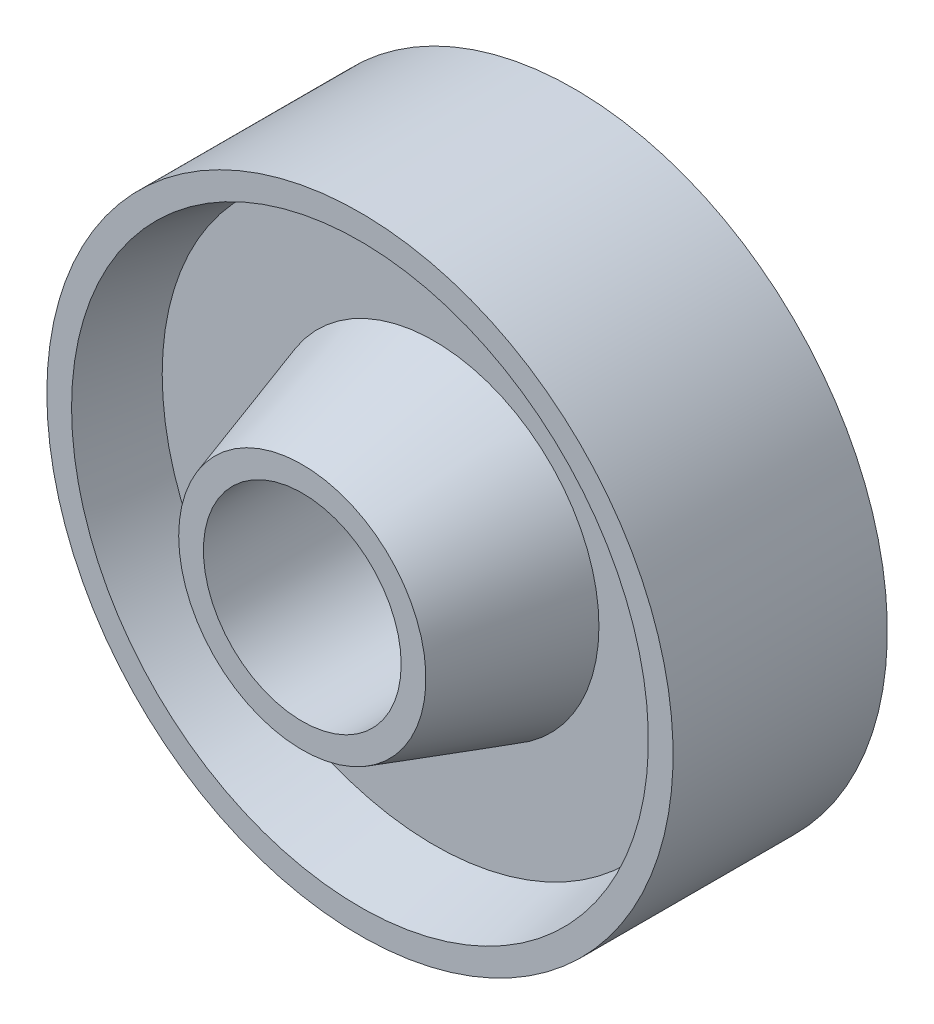
ISO-10303-21;
HEADER;
FILE_DESCRIPTION(('STEP AP214'),'2;1');
FILE_NAME('part.step','',(''),(''),'','','');
FILE_SCHEMA(('AUTOMOTIVE_DESIGN { 1 0 10303 214 1 1 1 1 }'));
ENDSEC;
DATA;
#1=APPLICATION_CONTEXT('core data for automotive mechanical design processes');
#2=APPLICATION_PROTOCOL_DEFINITION('international standard','automotive_design',2000,#1);
#3=PRODUCT_CONTEXT('',#1,'mechanical');
#4=PRODUCT('Part','Part','',(#3));
#5=PRODUCT_RELATED_PRODUCT_CATEGORY('part','',(#4));
#6=PRODUCT_DEFINITION_FORMATION('','',#4);
#7=PRODUCT_DEFINITION_CONTEXT('part definition',#1,'design');
#8=PRODUCT_DEFINITION('design','',#6,#7);
#9=PRODUCT_DEFINITION_SHAPE('','',#8);
#10=(LENGTH_UNIT() NAMED_UNIT(*) SI_UNIT(.MILLI.,.METRE.));
#11=(NAMED_UNIT(*) PLANE_ANGLE_UNIT() SI_UNIT($,.RADIAN.));
#12=(NAMED_UNIT(*) SI_UNIT($,.STERADIAN.) SOLID_ANGLE_UNIT());
#13=UNCERTAINTY_MEASURE_WITH_UNIT(LENGTH_MEASURE(1.E-05),#10,'distance_accuracy_value','');
#14=(GEOMETRIC_REPRESENTATION_CONTEXT(3) GLOBAL_UNCERTAINTY_ASSIGNED_CONTEXT((#13)) GLOBAL_UNIT_ASSIGNED_CONTEXT((#10,
#11,#12)) REPRESENTATION_CONTEXT('',''));
#15=CARTESIAN_POINT('',(0.,0.,0.));
#16=DIRECTION('',(0.,0.,1.));
#17=DIRECTION('',(1.,0.,0.));
#18=AXIS2_PLACEMENT_3D('',#15,#16,#17);
#19=CARTESIAN_POINT('',(15.,0.,-20.));
#20=DIRECTION('',(0.,0.,1.));
#21=DIRECTION('',(1.,0.,0.));
#22=AXIS2_PLACEMENT_3D('',#19,#20,#21);
#23=PLANE('',#22);
#24=CARTESIAN_POINT('',(0.,0.,-20.));
#25=DIRECTION('',(0.,0.,1.));
#26=DIRECTION('',(1.,0.,0.));
#27=AXIS2_PLACEMENT_3D('',#24,#25,#26);
#28=CIRCLE('',#27,12.);
#29=CARTESIAN_POINT('',(12.,0.,-20.));
#30=VERTEX_POINT('',#29);
#31=EDGE_CURVE('E68',#30,#30,#28,.F.);
#32=ORIENTED_EDGE('',*,*,#31,.F.);
#33=EDGE_LOOP('',(#32));
#34=FACE_BOUND('',#33,.T.);
#35=CARTESIAN_POINT('',(0.,0.,-20.));
#36=DIRECTION('',(0.,0.,-1.));
#37=DIRECTION('',(-1.,0.,0.));
#38=AXIS2_PLACEMENT_3D('',#35,#36,#37);
#39=CIRCLE('',#38,15.);
#40=CARTESIAN_POINT('',(-15.,0.,-20.));
#41=VERTEX_POINT('',#40);
#42=EDGE_CURVE('E65',#41,#41,#39,.T.);
#43=ORIENTED_EDGE('',*,*,#42,.T.);
#44=EDGE_LOOP('',(#43));
#45=FACE_BOUND('',#44,.T.);
#46=ADVANCED_FACE('F31',(#34,#45),#23,.F.);
#47=CARTESIAN_POINT('',(0.,0.,20.));
#48=DIRECTION('',(0.,0.,-1.));
#49=DIRECTION('',(-1.,0.,0.));
#50=AXIS2_PLACEMENT_3D('',#47,#48,#49);
#51=PLANE('',#50);
#52=CARTESIAN_POINT('',(0.,0.,20.));
#53=DIRECTION('',(0.,0.,1.));
#54=DIRECTION('',(1.,0.,0.));
#55=AXIS2_PLACEMENT_3D('',#52,#53,#54);
#56=CIRCLE('',#55,12.);
#57=CARTESIAN_POINT('',(12.,0.,20.));
#58=VERTEX_POINT('',#57);
#59=EDGE_CURVE('E71',#58,#58,#56,.T.);
#60=ORIENTED_EDGE('',*,*,#59,.F.);
#61=EDGE_LOOP('',(#60));
#62=FACE_BOUND('',#61,.T.);
#63=CARTESIAN_POINT('',(0.,0.,20.));
#64=DIRECTION('',(0.,0.,-1.));
#65=DIRECTION('',(-1.,0.,0.));
#66=AXIS2_PLACEMENT_3D('',#63,#64,#65);
#67=CIRCLE('',#66,15.);
#68=CARTESIAN_POINT('',(-15.,0.,20.));
#69=VERTEX_POINT('',#68);
#70=EDGE_CURVE('E10',#69,#69,#67,.T.);
#71=ORIENTED_EDGE('',*,*,#70,.F.);
#72=EDGE_LOOP('',(#71));
#73=FACE_BOUND('',#72,.T.);
#74=ADVANCED_FACE('F77',(#62,#73),#51,.F.);
#75=CARTESIAN_POINT('',(0.,0.,20.));
#76=DIRECTION('',(0.,0.,-1.));
#77=DIRECTION('',(-1.,0.,0.));
#78=AXIS2_PLACEMENT_3D('',#75,#76,#77);
#79=CONICAL_SURFACE('',#78,15.,0.302884868374971);
#80=CARTESIAN_POINT('',(0.,0.,4.));
#81=DIRECTION('',(0.,0.,-1.));
#82=DIRECTION('',(-1.,0.,0.));
#83=AXIS2_PLACEMENT_3D('',#80,#81,#82);
#84=CIRCLE('',#83,20.);
#85=CARTESIAN_POINT('',(-20.,0.,4.));
#86=VERTEX_POINT('',#85);
#87=EDGE_CURVE('E37',#86,#86,#84,.T.);
#88=ORIENTED_EDGE('',*,*,#87,.F.);
#89=EDGE_LOOP('',(#88));
#90=FACE_BOUND('',#89,.T.);
#91=ORIENTED_EDGE('',*,*,#70,.T.);
#92=EDGE_LOOP('',(#91));
#93=FACE_BOUND('',#92,.T.);
#94=ADVANCED_FACE('F80',(#90,#93),#79,.T.);
#95=CARTESIAN_POINT('',(20.,0.,4.));
#96=DIRECTION('',(0.,0.,-1.));
#97=DIRECTION('',(-1.,0.,0.));
#98=AXIS2_PLACEMENT_3D('',#95,#96,#97);
#99=PLANE('',#98);
#100=CARTESIAN_POINT('',(0.,0.,4.));
#101=DIRECTION('',(0.,0.,-1.));
#102=DIRECTION('',(-1.,0.,0.));
#103=AXIS2_PLACEMENT_3D('',#100,#101,#102);
#104=CIRCLE('',#103,33.);
#105=CARTESIAN_POINT('',(-33.,0.,4.));
#106=VERTEX_POINT('',#105);
#107=EDGE_CURVE('E41',#106,#106,#104,.T.);
#108=ORIENTED_EDGE('',*,*,#107,.F.);
#109=EDGE_LOOP('',(#108));
#110=FACE_BOUND('',#109,.T.);
#111=ORIENTED_EDGE('',*,*,#87,.T.);
#112=EDGE_LOOP('',(#111));
#113=FACE_BOUND('',#112,.T.);
#114=ADVANCED_FACE('F85',(#110,#113),#99,.F.);
#115=CARTESIAN_POINT('',(0.,0.,4.));
#116=DIRECTION('',(0.,0.,1.));
#117=DIRECTION('',(1.,0.,0.));
#118=AXIS2_PLACEMENT_3D('',#115,#116,#117);
#119=CONICAL_SURFACE('',#118,33.,0.218668945873941);
#120=CARTESIAN_POINT('',(0.,0.,13.));
#121=DIRECTION('',(0.,0.,-1.));
#122=DIRECTION('',(-1.,0.,0.));
#123=AXIS2_PLACEMENT_3D('',#120,#121,#122);
#124=CIRCLE('',#123,35.);
#125=CARTESIAN_POINT('',(-35.,0.,13.));
#126=VERTEX_POINT('',#125);
#127=EDGE_CURVE('E45',#126,#126,#124,.T.);
#128=ORIENTED_EDGE('',*,*,#127,.F.);
#129=EDGE_LOOP('',(#128));
#130=FACE_BOUND('',#129,.T.);
#131=ORIENTED_EDGE('',*,*,#107,.T.);
#132=EDGE_LOOP('',(#131));
#133=FACE_BOUND('',#132,.T.);
#134=ADVANCED_FACE('F92',(#130,#133),#119,.F.);
#135=CARTESIAN_POINT('',(35.,0.,13.));
#136=DIRECTION('',(0.,0.,-1.));
#137=DIRECTION('',(-1.,0.,0.));
#138=AXIS2_PLACEMENT_3D('',#135,#136,#137);
#139=PLANE('',#138);
#140=CARTESIAN_POINT('',(0.,0.,13.));
#141=DIRECTION('',(0.,0.,-1.));
#142=DIRECTION('',(-1.,0.,0.));
#143=AXIS2_PLACEMENT_3D('',#140,#141,#142);
#144=CIRCLE('',#143,38.);
#145=CARTESIAN_POINT('',(-38.,0.,13.));
#146=VERTEX_POINT('',#145);
#147=EDGE_CURVE('E50',#146,#146,#144,.T.);
#148=ORIENTED_EDGE('',*,*,#147,.F.);
#149=EDGE_LOOP('',(#148));
#150=FACE_BOUND('',#149,.T.);
#151=ORIENTED_EDGE('',*,*,#127,.T.);
#152=EDGE_LOOP('',(#151));
#153=FACE_BOUND('',#152,.T.);
#154=ADVANCED_FACE('F96',(#150,#153),#139,.F.);
#155=CARTESIAN_POINT('',(0.,0.,-47.3507462686568));
#156=DIRECTION('',(0.,0.,-1.));
#157=DIRECTION('',(-1.,0.,0.));
#158=AXIS2_PLACEMENT_3D('',#155,#156,#157);
#159=CYLINDRICAL_SURFACE('',#158,38.);
#160=CARTESIAN_POINT('',(0.,0.,-13.));
#161=DIRECTION('',(0.,0.,-1.));
#162=DIRECTION('',(-1.,0.,0.));
#163=AXIS2_PLACEMENT_3D('',#160,#161,#162);
#164=CIRCLE('',#163,38.);
#165=CARTESIAN_POINT('',(-38.,0.,-13.));
#166=VERTEX_POINT('',#165);
#167=EDGE_CURVE('E53',#166,#166,#164,.T.);
#168=ORIENTED_EDGE('',*,*,#167,.F.);
#169=EDGE_LOOP('',(#168));
#170=FACE_BOUND('',#169,.T.);
#171=ORIENTED_EDGE('',*,*,#147,.T.);
#172=EDGE_LOOP('',(#171));
#173=FACE_BOUND('',#172,.T.);
#174=ADVANCED_FACE('F100',(#170,#173),#159,.T.);
#175=CARTESIAN_POINT('',(38.,0.,-13.));
#176=DIRECTION('',(0.,0.,1.));
#177=DIRECTION('',(1.,0.,0.));
#178=AXIS2_PLACEMENT_3D('',#175,#176,#177);
#179=PLANE('',#178);
#180=CARTESIAN_POINT('',(0.,0.,-13.));
#181=DIRECTION('',(0.,0.,-1.));
#182=DIRECTION('',(-1.,0.,0.));
#183=AXIS2_PLACEMENT_3D('',#180,#181,#182);
#184=CIRCLE('',#183,35.);
#185=CARTESIAN_POINT('',(-35.,0.,-13.));
#186=VERTEX_POINT('',#185);
#187=EDGE_CURVE('E56',#186,#186,#184,.T.);
#188=ORIENTED_EDGE('',*,*,#187,.F.);
#189=EDGE_LOOP('',(#188));
#190=FACE_BOUND('',#189,.T.);
#191=ORIENTED_EDGE('',*,*,#167,.T.);
#192=EDGE_LOOP('',(#191));
#193=FACE_BOUND('',#192,.T.);
#194=ADVANCED_FACE('F104',(#190,#193),#179,.F.);
#195=CARTESIAN_POINT('',(0.,0.,-13.));
#196=DIRECTION('',(0.,0.,-1.));
#197=DIRECTION('',(-1.,0.,0.));
#198=AXIS2_PLACEMENT_3D('',#195,#196,#197);
#199=CONICAL_SURFACE('',#198,35.,0.218668945873941);
#200=CARTESIAN_POINT('',(0.,0.,-4.));
#201=DIRECTION('',(0.,0.,-1.));
#202=DIRECTION('',(-1.,0.,0.));
#203=AXIS2_PLACEMENT_3D('',#200,#201,#202);
#204=CIRCLE('',#203,33.);
#205=CARTESIAN_POINT('',(-33.,0.,-4.));
#206=VERTEX_POINT('',#205);
#207=EDGE_CURVE('E59',#206,#206,#204,.T.);
#208=ORIENTED_EDGE('',*,*,#207,.F.);
#209=EDGE_LOOP('',(#208));
#210=FACE_BOUND('',#209,.T.);
#211=ORIENTED_EDGE('',*,*,#187,.T.);
#212=EDGE_LOOP('',(#211));
#213=FACE_BOUND('',#212,.T.);
#214=ADVANCED_FACE('F108',(#210,#213),#199,.F.);
#215=CARTESIAN_POINT('',(33.,0.,-4.));
#216=DIRECTION('',(0.,0.,1.));
#217=DIRECTION('',(1.,0.,0.));
#218=AXIS2_PLACEMENT_3D('',#215,#216,#217);
#219=PLANE('',#218);
#220=CARTESIAN_POINT('',(0.,0.,-4.));
#221=DIRECTION('',(0.,0.,-1.));
#222=DIRECTION('',(-1.,0.,0.));
#223=AXIS2_PLACEMENT_3D('',#220,#221,#222);
#224=CIRCLE('',#223,20.);
#225=CARTESIAN_POINT('',(-20.,0.,-4.));
#226=VERTEX_POINT('',#225);
#227=EDGE_CURVE('E62',#226,#226,#224,.T.);
#228=ORIENTED_EDGE('',*,*,#227,.F.);
#229=EDGE_LOOP('',(#228));
#230=FACE_BOUND('',#229,.T.);
#231=ORIENTED_EDGE('',*,*,#207,.T.);
#232=EDGE_LOOP('',(#231));
#233=FACE_BOUND('',#232,.T.);
#234=ADVANCED_FACE('F112',(#230,#233),#219,.F.);
#235=CARTESIAN_POINT('',(0.,0.,-4.));
#236=DIRECTION('',(0.,0.,1.));
#237=DIRECTION('',(1.,0.,0.));
#238=AXIS2_PLACEMENT_3D('',#235,#236,#237);
#239=CONICAL_SURFACE('',#238,20.,0.302884868374971);
#240=ORIENTED_EDGE('',*,*,#42,.F.);
#241=EDGE_LOOP('',(#240));
#242=FACE_BOUND('',#241,.T.);
#243=ORIENTED_EDGE('',*,*,#227,.T.);
#244=EDGE_LOOP('',(#243));
#245=FACE_BOUND('',#244,.T.);
#246=ADVANCED_FACE('F116',(#242,#245),#239,.T.);
#247=CARTESIAN_POINT('',(0.,0.,-53.9411254969543));
#248=DIRECTION('',(0.,0.,1.));
#249=DIRECTION('',(1.,0.,0.));
#250=AXIS2_PLACEMENT_3D('',#247,#248,#249);
#251=CYLINDRICAL_SURFACE('',#250,12.);
#252=ORIENTED_EDGE('',*,*,#31,.T.);
#253=EDGE_LOOP('',(#252));
#254=FACE_BOUND('',#253,.T.);
#255=ORIENTED_EDGE('',*,*,#59,.T.);
#256=EDGE_LOOP('',(#255));
#257=FACE_BOUND('',#256,.T.);
#258=ADVANCED_FACE('F75',(#254,#257),#251,.F.);
#259=CLOSED_SHELL('',(#46,#74,#94,#114,#134,#154,#174,#194,#214,#234,#246,#258));
#260=MANIFOLD_SOLID_BREP('B2',#259);
#261=ADVANCED_BREP_SHAPE_REPRESENTATION('',(#18,#260),#14);
#262=SHAPE_DEFINITION_REPRESENTATION(#9,#261);
ENDSEC;
END-ISO-10303-21;
